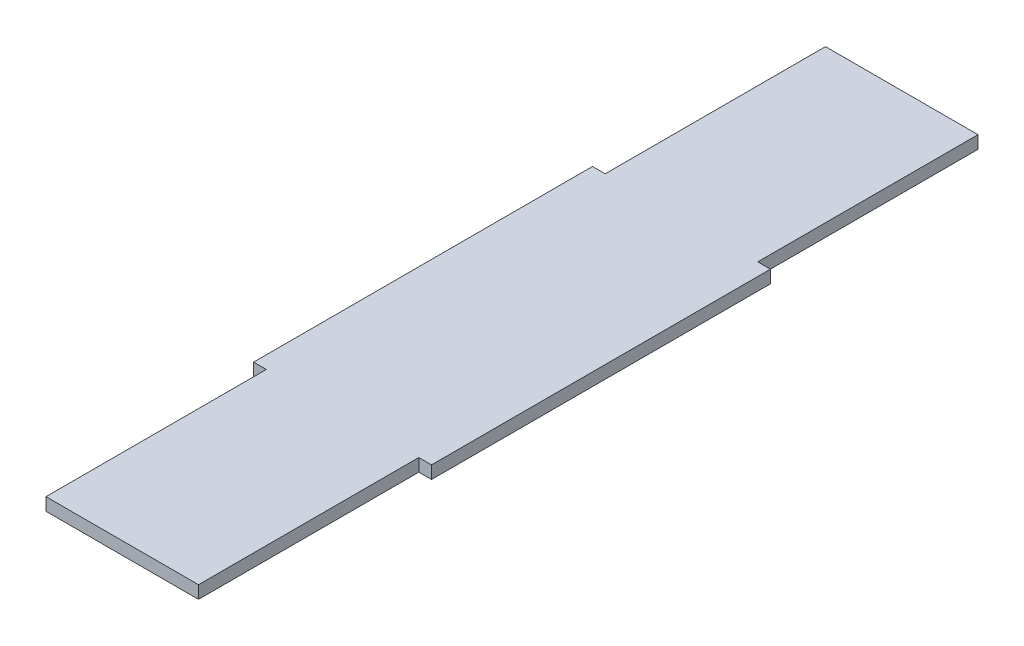
ISO-10303-21;
HEADER;
FILE_DESCRIPTION(('STEP AP214'),'2;1');
FILE_NAME('part.step','',(''),(''),'','','');
FILE_SCHEMA(('AUTOMOTIVE_DESIGN { 1 0 10303 214 1 1 1 1 }'));
ENDSEC;
DATA;
#1=APPLICATION_CONTEXT('core data for automotive mechanical design processes');
#2=APPLICATION_PROTOCOL_DEFINITION('international standard','automotive_design',2000,#1);
#3=PRODUCT_CONTEXT('',#1,'mechanical');
#4=PRODUCT('Part','Part','',(#3));
#5=PRODUCT_RELATED_PRODUCT_CATEGORY('part','',(#4));
#6=PRODUCT_DEFINITION_FORMATION('','',#4);
#7=PRODUCT_DEFINITION_CONTEXT('part definition',#1,'design');
#8=PRODUCT_DEFINITION('design','',#6,#7);
#9=PRODUCT_DEFINITION_SHAPE('','',#8);
#10=(LENGTH_UNIT() NAMED_UNIT(*) SI_UNIT(.MILLI.,.METRE.));
#11=(NAMED_UNIT(*) PLANE_ANGLE_UNIT() SI_UNIT($,.RADIAN.));
#12=(NAMED_UNIT(*) SI_UNIT($,.STERADIAN.) SOLID_ANGLE_UNIT());
#13=UNCERTAINTY_MEASURE_WITH_UNIT(LENGTH_MEASURE(1.E-05),#10,'distance_accuracy_value','');
#14=(GEOMETRIC_REPRESENTATION_CONTEXT(3) GLOBAL_UNCERTAINTY_ASSIGNED_CONTEXT((#13)) GLOBAL_UNIT_ASSIGNED_CONTEXT((#10,
#11,#12)) REPRESENTATION_CONTEXT('',''));
#15=CARTESIAN_POINT('',(0.,0.,0.));
#16=DIRECTION('',(0.,0.,1.));
#17=DIRECTION('',(1.,0.,0.));
#18=AXIS2_PLACEMENT_3D('',#15,#16,#17);
#19=CARTESIAN_POINT('',(-18.,3.,0.));
#20=DIRECTION('',(-1.,0.,0.));
#21=DIRECTION('',(0.,0.,1.));
#22=AXIS2_PLACEMENT_3D('',#19,#20,#21);
#23=PLANE('',#22);
#24=DIRECTION('',(0.,0.,-1.));
#25=VECTOR('',#24,1.);
#26=CARTESIAN_POINT('',(-18.,0.,0.));
#27=LINE('',#26,#25);
#28=CARTESIAN_POINT('',(-18.,0.,-40.));
#29=VERTEX_POINT('',#28);
#30=CARTESIAN_POINT('',(-18.,0.,-92.));
#31=VERTEX_POINT('',#30);
#32=EDGE_CURVE('E211',#29,#31,#27,.T.);
#33=ORIENTED_EDGE('',*,*,#32,.F.);
#34=DIRECTION('',(0.,-1.,0.));
#35=VECTOR('',#34,1.);
#36=CARTESIAN_POINT('',(-18.,3.,-40.));
#37=LINE('',#36,#35);
#38=CARTESIAN_POINT('',(-18.,3.,-40.));
#39=VERTEX_POINT('',#38);
#40=EDGE_CURVE('E11',#39,#29,#37,.T.);
#41=ORIENTED_EDGE('',*,*,#40,.F.);
#42=DIRECTION('',(0.,0.,-1.));
#43=VECTOR('',#42,1.);
#44=CARTESIAN_POINT('',(-18.,3.,0.));
#45=LINE('',#44,#43);
#46=CARTESIAN_POINT('',(-18.,3.,-92.));
#47=VERTEX_POINT('',#46);
#48=EDGE_CURVE('E167',#39,#47,#45,.T.);
#49=ORIENTED_EDGE('',*,*,#48,.T.);
#50=DIRECTION('',(0.,-1.,0.));
#51=VECTOR('',#50,1.);
#52=CARTESIAN_POINT('',(-18.,3.,-92.));
#53=LINE('',#52,#51);
#54=EDGE_CURVE('E52',#47,#31,#53,.T.);
#55=ORIENTED_EDGE('',*,*,#54,.T.);
#56=EDGE_LOOP('',(#33,#41,#49,#55));
#57=FACE_BOUND('',#56,.T.);
#58=ADVANCED_FACE('F35',(#57),#23,.T.);
#59=CARTESIAN_POINT('',(0.,3.,-40.));
#60=DIRECTION('',(0.,0.,-1.));
#61=DIRECTION('',(-1.,0.,0.));
#62=AXIS2_PLACEMENT_3D('',#59,#60,#61);
#63=PLANE('',#62);
#64=DIRECTION('',(1.,0.,0.));
#65=VECTOR('',#64,1.);
#66=CARTESIAN_POINT('',(0.,0.,-40.));
#67=LINE('',#66,#65);
#68=CARTESIAN_POINT('',(-21.,0.,-40.));
#69=VERTEX_POINT('',#68);
#70=EDGE_CURVE('E210',#69,#29,#67,.T.);
#71=ORIENTED_EDGE('',*,*,#70,.F.);
#72=DIRECTION('',(0.,-1.,0.));
#73=VECTOR('',#72,1.);
#74=CARTESIAN_POINT('',(-21.,3.,-40.));
#75=LINE('',#74,#73);
#76=CARTESIAN_POINT('',(-21.,3.,-40.));
#77=VERTEX_POINT('',#76);
#78=EDGE_CURVE('E44',#77,#69,#75,.T.);
#79=ORIENTED_EDGE('',*,*,#78,.F.);
#80=DIRECTION('',(1.,0.,0.));
#81=VECTOR('',#80,1.);
#82=CARTESIAN_POINT('',(0.,3.,-40.));
#83=LINE('',#82,#81);
#84=EDGE_CURVE('E173',#77,#39,#83,.T.);
#85=ORIENTED_EDGE('',*,*,#84,.T.);
#86=ORIENTED_EDGE('',*,*,#40,.T.);
#87=EDGE_LOOP('',(#71,#79,#85,#86));
#88=FACE_BOUND('',#87,.T.);
#89=ADVANCED_FACE('F37',(#88),#63,.T.);
#90=CARTESIAN_POINT('',(-21.,3.,0.));
#91=DIRECTION('',(-1.,0.,0.));
#92=DIRECTION('',(0.,0.,1.));
#93=AXIS2_PLACEMENT_3D('',#90,#91,#92);
#94=PLANE('',#93);
#95=DIRECTION('',(0.,0.,-1.));
#96=VECTOR('',#95,1.);
#97=CARTESIAN_POINT('',(-21.,0.,0.));
#98=LINE('',#97,#96);
#99=CARTESIAN_POINT('',(-21.,0.,40.));
#100=VERTEX_POINT('',#99);
#101=EDGE_CURVE('E205',#100,#69,#98,.T.);
#102=ORIENTED_EDGE('',*,*,#101,.F.);
#103=DIRECTION('',(0.,-1.,0.));
#104=VECTOR('',#103,1.);
#105=CARTESIAN_POINT('',(-21.,3.,40.));
#106=LINE('',#105,#104);
#107=CARTESIAN_POINT('',(-21.,3.,40.));
#108=VERTEX_POINT('',#107);
#109=EDGE_CURVE('E199',#108,#100,#106,.T.);
#110=ORIENTED_EDGE('',*,*,#109,.F.);
#111=DIRECTION('',(0.,0.,-1.));
#112=VECTOR('',#111,1.);
#113=CARTESIAN_POINT('',(-21.,3.,0.));
#114=LINE('',#113,#112);
#115=EDGE_CURVE('E170',#108,#77,#114,.T.);
#116=ORIENTED_EDGE('',*,*,#115,.T.);
#117=ORIENTED_EDGE('',*,*,#78,.T.);
#118=EDGE_LOOP('',(#102,#110,#116,#117));
#119=FACE_BOUND('',#118,.T.);
#120=ADVANCED_FACE('F203',(#119),#94,.T.);
#121=CARTESIAN_POINT('',(0.,3.,40.));
#122=DIRECTION('',(0.,0.,-1.));
#123=DIRECTION('',(-1.,0.,0.));
#124=AXIS2_PLACEMENT_3D('',#121,#122,#123);
#125=PLANE('',#124);
#126=DIRECTION('',(1.,0.,0.));
#127=VECTOR('',#126,1.);
#128=CARTESIAN_POINT('',(0.,0.,40.));
#129=LINE('',#128,#127);
#130=CARTESIAN_POINT('',(-18.,0.,40.));
#131=VERTEX_POINT('',#130);
#132=EDGE_CURVE('E217',#100,#131,#129,.T.);
#133=ORIENTED_EDGE('',*,*,#132,.T.);
#134=DIRECTION('',(0.,-1.,0.));
#135=VECTOR('',#134,1.);
#136=CARTESIAN_POINT('',(-18.,3.,40.));
#137=LINE('',#136,#135);
#138=CARTESIAN_POINT('',(-18.,3.,40.));
#139=VERTEX_POINT('',#138);
#140=EDGE_CURVE('E197',#139,#131,#137,.T.);
#141=ORIENTED_EDGE('',*,*,#140,.F.);
#142=DIRECTION('',(1.,0.,0.));
#143=VECTOR('',#142,1.);
#144=CARTESIAN_POINT('',(0.,3.,40.));
#145=LINE('',#144,#143);
#146=EDGE_CURVE('E165',#108,#139,#145,.T.);
#147=ORIENTED_EDGE('',*,*,#146,.F.);
#148=ORIENTED_EDGE('',*,*,#109,.T.);
#149=EDGE_LOOP('',(#133,#141,#147,#148));
#150=FACE_BOUND('',#149,.T.);
#151=ADVANCED_FACE('F263',(#150),#125,.F.);
#152=CARTESIAN_POINT('',(-18.,0.,92.));
#153=VERTEX_POINT('',#152);
#154=EDGE_CURVE('E219',#153,#131,#27,.T.);
#155=ORIENTED_EDGE('',*,*,#154,.F.);
#156=DIRECTION('',(0.,-1.,0.));
#157=VECTOR('',#156,1.);
#158=CARTESIAN_POINT('',(-18.,3.,92.));
#159=LINE('',#158,#157);
#160=CARTESIAN_POINT('',(-18.,3.,92.));
#161=VERTEX_POINT('',#160);
#162=EDGE_CURVE('E195',#161,#153,#159,.T.);
#163=ORIENTED_EDGE('',*,*,#162,.F.);
#164=EDGE_CURVE('E160',#161,#139,#45,.T.);
#165=ORIENTED_EDGE('',*,*,#164,.T.);
#166=ORIENTED_EDGE('',*,*,#140,.T.);
#167=EDGE_LOOP('',(#155,#163,#165,#166));
#168=FACE_BOUND('',#167,.T.);
#169=ADVANCED_FACE('F242',(#168),#23,.T.);
#170=CARTESIAN_POINT('',(0.,3.,92.));
#171=DIRECTION('',(0.,0.,-1.));
#172=DIRECTION('',(-1.,0.,0.));
#173=AXIS2_PLACEMENT_3D('',#170,#171,#172);
#174=PLANE('',#173);
#175=DIRECTION('',(1.,0.,0.));
#176=VECTOR('',#175,1.);
#177=CARTESIAN_POINT('',(0.,0.,92.));
#178=LINE('',#177,#176);
#179=CARTESIAN_POINT('',(18.,0.,92.));
#180=VERTEX_POINT('',#179);
#181=EDGE_CURVE('E223',#153,#180,#178,.T.);
#182=ORIENTED_EDGE('',*,*,#181,.T.);
#183=DIRECTION('',(0.,-1.,0.));
#184=VECTOR('',#183,1.);
#185=CARTESIAN_POINT('',(18.,3.,92.));
#186=LINE('',#185,#184);
#187=CARTESIAN_POINT('',(18.,3.,92.));
#188=VERTEX_POINT('',#187);
#189=EDGE_CURVE('E192',#188,#180,#186,.T.);
#190=ORIENTED_EDGE('',*,*,#189,.F.);
#191=DIRECTION('',(1.,0.,0.));
#192=VECTOR('',#191,1.);
#193=CARTESIAN_POINT('',(0.,3.,92.));
#194=LINE('',#193,#192);
#195=EDGE_CURVE('E156',#161,#188,#194,.T.);
#196=ORIENTED_EDGE('',*,*,#195,.F.);
#197=ORIENTED_EDGE('',*,*,#162,.T.);
#198=EDGE_LOOP('',(#182,#190,#196,#197));
#199=FACE_BOUND('',#198,.T.);
#200=ADVANCED_FACE('F262',(#199),#174,.F.);
#201=CARTESIAN_POINT('',(18.,3.,0.));
#202=DIRECTION('',(-1.,0.,0.));
#203=DIRECTION('',(0.,0.,1.));
#204=AXIS2_PLACEMENT_3D('',#201,#202,#203);
#205=PLANE('',#204);
#206=DIRECTION('',(0.,0.,-1.));
#207=VECTOR('',#206,1.);
#208=CARTESIAN_POINT('',(18.,0.,0.));
#209=LINE('',#208,#207);
#210=CARTESIAN_POINT('',(18.,0.,40.));
#211=VERTEX_POINT('',#210);
#212=EDGE_CURVE('E181',#180,#211,#209,.T.);
#213=ORIENTED_EDGE('',*,*,#212,.T.);
#214=DIRECTION('',(0.,-1.,0.));
#215=VECTOR('',#214,1.);
#216=CARTESIAN_POINT('',(18.,3.,40.));
#217=LINE('',#216,#215);
#218=CARTESIAN_POINT('',(18.,3.,40.));
#219=VERTEX_POINT('',#218);
#220=EDGE_CURVE('E190',#219,#211,#217,.T.);
#221=ORIENTED_EDGE('',*,*,#220,.F.);
#222=DIRECTION('',(0.,0.,-1.));
#223=VECTOR('',#222,1.);
#224=CARTESIAN_POINT('',(18.,3.,0.));
#225=LINE('',#224,#223);
#226=EDGE_CURVE('E151',#188,#219,#225,.T.);
#227=ORIENTED_EDGE('',*,*,#226,.F.);
#228=ORIENTED_EDGE('',*,*,#189,.T.);
#229=EDGE_LOOP('',(#213,#221,#227,#228));
#230=FACE_BOUND('',#229,.T.);
#231=ADVANCED_FACE('F237',(#230),#205,.F.);
#232=CARTESIAN_POINT('',(0.,3.,40.));
#233=DIRECTION('',(0.,0.,1.));
#234=DIRECTION('',(1.,0.,0.));
#235=AXIS2_PLACEMENT_3D('',#232,#233,#234);
#236=PLANE('',#235);
#237=DIRECTION('',(-1.,0.,0.));
#238=VECTOR('',#237,1.);
#239=CARTESIAN_POINT('',(0.,0.,40.));
#240=LINE('',#239,#238);
#241=CARTESIAN_POINT('',(21.,0.,40.));
#242=VERTEX_POINT('',#241);
#243=EDGE_CURVE('E226',#242,#211,#240,.T.);
#244=ORIENTED_EDGE('',*,*,#243,.F.);
#245=DIRECTION('',(0.,-1.,0.));
#246=VECTOR('',#245,1.);
#247=CARTESIAN_POINT('',(21.,3.,40.));
#248=LINE('',#247,#246);
#249=CARTESIAN_POINT('',(21.,3.,40.));
#250=VERTEX_POINT('',#249);
#251=EDGE_CURVE('E188',#250,#242,#248,.T.);
#252=ORIENTED_EDGE('',*,*,#251,.F.);
#253=DIRECTION('',(-1.,0.,0.));
#254=VECTOR('',#253,1.);
#255=CARTESIAN_POINT('',(0.,3.,40.));
#256=LINE('',#255,#254);
#257=EDGE_CURVE('E155',#250,#219,#256,.T.);
#258=ORIENTED_EDGE('',*,*,#257,.T.);
#259=ORIENTED_EDGE('',*,*,#220,.T.);
#260=EDGE_LOOP('',(#244,#252,#258,#259));
#261=FACE_BOUND('',#260,.T.);
#262=ADVANCED_FACE('F235',(#261),#236,.T.);
#263=CARTESIAN_POINT('',(21.,3.,0.));
#264=DIRECTION('',(-1.,0.,0.));
#265=DIRECTION('',(0.,0.,1.));
#266=AXIS2_PLACEMENT_3D('',#263,#264,#265);
#267=PLANE('',#266);
#268=DIRECTION('',(0.,0.,-1.));
#269=VECTOR('',#268,1.);
#270=CARTESIAN_POINT('',(21.,0.,0.));
#271=LINE('',#270,#269);
#272=CARTESIAN_POINT('',(21.,0.,-40.));
#273=VERTEX_POINT('',#272);
#274=EDGE_CURVE('E228',#242,#273,#271,.T.);
#275=ORIENTED_EDGE('',*,*,#274,.T.);
#276=DIRECTION('',(0.,-1.,0.));
#277=VECTOR('',#276,1.);
#278=CARTESIAN_POINT('',(21.,3.,-40.));
#279=LINE('',#278,#277);
#280=CARTESIAN_POINT('',(21.,3.,-40.));
#281=VERTEX_POINT('',#280);
#282=EDGE_CURVE('E146',#281,#273,#279,.T.);
#283=ORIENTED_EDGE('',*,*,#282,.F.);
#284=DIRECTION('',(0.,0.,-1.));
#285=VECTOR('',#284,1.);
#286=CARTESIAN_POINT('',(21.,3.,0.));
#287=LINE('',#286,#285);
#288=EDGE_CURVE('E134',#250,#281,#287,.T.);
#289=ORIENTED_EDGE('',*,*,#288,.F.);
#290=ORIENTED_EDGE('',*,*,#251,.T.);
#291=EDGE_LOOP('',(#275,#283,#289,#290));
#292=FACE_BOUND('',#291,.T.);
#293=ADVANCED_FACE('F231',(#292),#267,.F.);
#294=CARTESIAN_POINT('',(0.,3.,-40.));
#295=DIRECTION('',(0.,0.,1.));
#296=DIRECTION('',(1.,0.,0.));
#297=AXIS2_PLACEMENT_3D('',#294,#295,#296);
#298=PLANE('',#297);
#299=DIRECTION('',(-1.,0.,0.));
#300=VECTOR('',#299,1.);
#301=CARTESIAN_POINT('',(0.,0.,-40.));
#302=LINE('',#301,#300);
#303=CARTESIAN_POINT('',(18.,0.,-40.));
#304=VERTEX_POINT('',#303);
#305=EDGE_CURVE('E143',#273,#304,#302,.T.);
#306=ORIENTED_EDGE('',*,*,#305,.T.);
#307=DIRECTION('',(0.,-1.,0.));
#308=VECTOR('',#307,1.);
#309=CARTESIAN_POINT('',(18.,3.,-40.));
#310=LINE('',#309,#308);
#311=CARTESIAN_POINT('',(18.,3.,-40.));
#312=VERTEX_POINT('',#311);
#313=EDGE_CURVE('E140',#312,#304,#310,.T.);
#314=ORIENTED_EDGE('',*,*,#313,.F.);
#315=DIRECTION('',(-1.,0.,0.));
#316=VECTOR('',#315,1.);
#317=CARTESIAN_POINT('',(0.,3.,-40.));
#318=LINE('',#317,#316);
#319=EDGE_CURVE('E126',#281,#312,#318,.T.);
#320=ORIENTED_EDGE('',*,*,#319,.F.);
#321=ORIENTED_EDGE('',*,*,#282,.T.);
#322=EDGE_LOOP('',(#306,#314,#320,#321));
#323=FACE_BOUND('',#322,.T.);
#324=ADVANCED_FACE('F141',(#323),#298,.F.);
#325=CARTESIAN_POINT('',(18.,0.,-92.));
#326=VERTEX_POINT('',#325);
#327=EDGE_CURVE('E177',#304,#326,#209,.T.);
#328=ORIENTED_EDGE('',*,*,#327,.T.);
#329=DIRECTION('',(0.,-1.,0.));
#330=VECTOR('',#329,1.);
#331=CARTESIAN_POINT('',(18.,3.,-92.));
#332=LINE('',#331,#330);
#333=CARTESIAN_POINT('',(18.,3.,-92.));
#334=VERTEX_POINT('',#333);
#335=EDGE_CURVE('E90',#334,#326,#332,.T.);
#336=ORIENTED_EDGE('',*,*,#335,.F.);
#337=EDGE_CURVE('E131',#312,#334,#225,.T.);
#338=ORIENTED_EDGE('',*,*,#337,.F.);
#339=ORIENTED_EDGE('',*,*,#313,.T.);
#340=EDGE_LOOP('',(#328,#336,#338,#339));
#341=FACE_BOUND('',#340,.T.);
#342=ADVANCED_FACE('F148',(#341),#205,.F.);
#343=CARTESIAN_POINT('',(0.,3.,-92.));
#344=DIRECTION('',(0.,0.,-1.));
#345=DIRECTION('',(-1.,0.,0.));
#346=AXIS2_PLACEMENT_3D('',#343,#344,#345);
#347=PLANE('',#346);
#348=DIRECTION('',(1.,0.,0.));
#349=VECTOR('',#348,1.);
#350=CARTESIAN_POINT('',(0.,0.,-92.));
#351=LINE('',#350,#349);
#352=EDGE_CURVE('E175',#31,#326,#351,.T.);
#353=ORIENTED_EDGE('',*,*,#352,.F.);
#354=ORIENTED_EDGE('',*,*,#54,.F.);
#355=DIRECTION('',(1.,0.,0.));
#356=VECTOR('',#355,1.);
#357=CARTESIAN_POINT('',(0.,3.,-92.));
#358=LINE('',#357,#356);
#359=EDGE_CURVE('E149',#47,#334,#358,.T.);
#360=ORIENTED_EDGE('',*,*,#359,.T.);
#361=ORIENTED_EDGE('',*,*,#335,.T.);
#362=EDGE_LOOP('',(#353,#354,#360,#361));
#363=FACE_BOUND('',#362,.T.);
#364=ADVANCED_FACE('F244',(#363),#347,.T.);
#365=CARTESIAN_POINT('',(0.,3.,0.));
#366=DIRECTION('',(0.,1.,0.));
#367=DIRECTION('',(0.,0.,1.));
#368=AXIS2_PLACEMENT_3D('',#365,#366,#367);
#369=PLANE('',#368);
#370=ORIENTED_EDGE('',*,*,#48,.F.);
#371=ORIENTED_EDGE('',*,*,#84,.F.);
#372=ORIENTED_EDGE('',*,*,#115,.F.);
#373=ORIENTED_EDGE('',*,*,#146,.T.);
#374=ORIENTED_EDGE('',*,*,#164,.F.);
#375=ORIENTED_EDGE('',*,*,#195,.T.);
#376=ORIENTED_EDGE('',*,*,#226,.T.);
#377=ORIENTED_EDGE('',*,*,#257,.F.);
#378=ORIENTED_EDGE('',*,*,#288,.T.);
#379=ORIENTED_EDGE('',*,*,#319,.T.);
#380=ORIENTED_EDGE('',*,*,#337,.T.);
#381=ORIENTED_EDGE('',*,*,#359,.F.);
#382=EDGE_LOOP('',(#370,#371,#372,#373,#374,#375,#376,#377,#378,#379,#380,#381));
#383=FACE_BOUND('',#382,.T.);
#384=ADVANCED_FACE('F128',(#383),#369,.T.);
#385=CARTESIAN_POINT('',(0.,0.,0.));
#386=DIRECTION('',(0.,1.,0.));
#387=DIRECTION('',(0.,0.,1.));
#388=AXIS2_PLACEMENT_3D('',#385,#386,#387);
#389=PLANE('',#388);
#390=ORIENTED_EDGE('',*,*,#32,.T.);
#391=ORIENTED_EDGE('',*,*,#352,.T.);
#392=ORIENTED_EDGE('',*,*,#327,.F.);
#393=ORIENTED_EDGE('',*,*,#305,.F.);
#394=ORIENTED_EDGE('',*,*,#274,.F.);
#395=ORIENTED_EDGE('',*,*,#243,.T.);
#396=ORIENTED_EDGE('',*,*,#212,.F.);
#397=ORIENTED_EDGE('',*,*,#181,.F.);
#398=ORIENTED_EDGE('',*,*,#154,.T.);
#399=ORIENTED_EDGE('',*,*,#132,.F.);
#400=ORIENTED_EDGE('',*,*,#101,.T.);
#401=ORIENTED_EDGE('',*,*,#70,.T.);
#402=EDGE_LOOP('',(#390,#391,#392,#393,#394,#395,#396,#397,#398,#399,#400,#401));
#403=FACE_BOUND('',#402,.T.);
#404=ADVANCED_FACE('F214',(#403),#389,.F.);
#405=CLOSED_SHELL('',(#58,#89,#120,#151,#169,#200,#231,#262,#293,#324,#342,#364,#384,#404));
#406=MANIFOLD_SOLID_BREP('B2',#405);
#407=ADVANCED_BREP_SHAPE_REPRESENTATION('',(#18,#406),#14);
#408=SHAPE_DEFINITION_REPRESENTATION(#9,#407);
ENDSEC;
END-ISO-10303-21;
